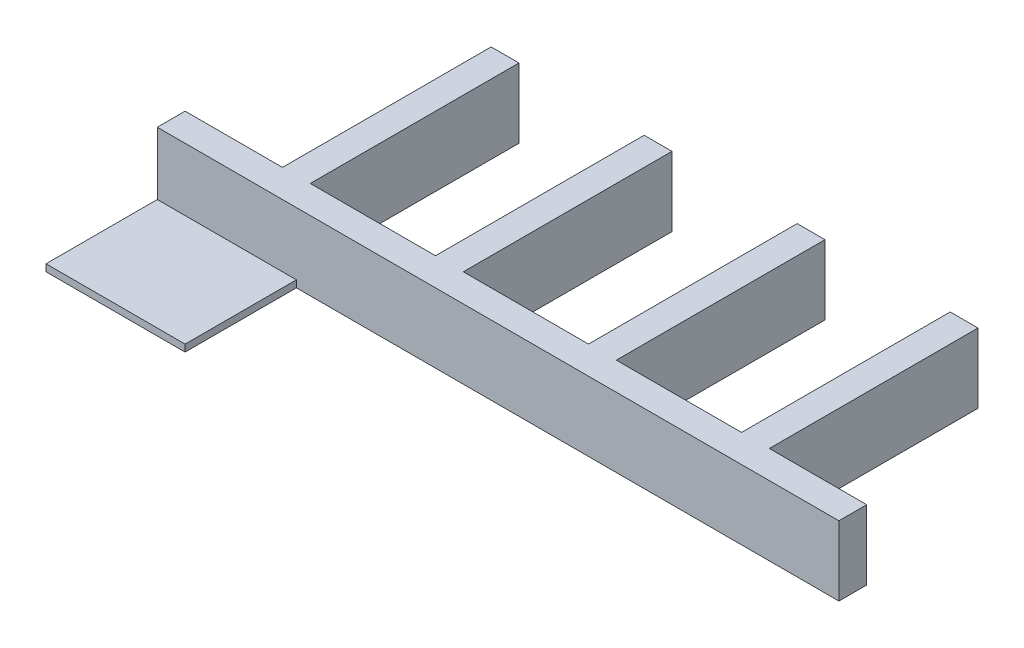
ISO-10303-21;
HEADER;
FILE_DESCRIPTION(('STEP AP214'),'2;1');
FILE_NAME('part.step','',(''),(''),'','','');
FILE_SCHEMA(('AUTOMOTIVE_DESIGN { 1 0 10303 214 1 1 1 1 }'));
ENDSEC;
DATA;
#1=APPLICATION_CONTEXT('core data for automotive mechanical design processes');
#2=APPLICATION_PROTOCOL_DEFINITION('international standard','automotive_design',2000,#1);
#3=PRODUCT_CONTEXT('',#1,'mechanical');
#4=PRODUCT('Part','Part','',(#3));
#5=PRODUCT_RELATED_PRODUCT_CATEGORY('part','',(#4));
#6=PRODUCT_DEFINITION_FORMATION('','',#4);
#7=PRODUCT_DEFINITION_CONTEXT('part definition',#1,'design');
#8=PRODUCT_DEFINITION('design','',#6,#7);
#9=PRODUCT_DEFINITION_SHAPE('','',#8);
#10=(LENGTH_UNIT() NAMED_UNIT(*) SI_UNIT(.MILLI.,.METRE.));
#11=(NAMED_UNIT(*) PLANE_ANGLE_UNIT() SI_UNIT($,.RADIAN.));
#12=(NAMED_UNIT(*) SI_UNIT($,.STERADIAN.) SOLID_ANGLE_UNIT());
#13=UNCERTAINTY_MEASURE_WITH_UNIT(LENGTH_MEASURE(1.E-05),#10,'distance_accuracy_value','');
#14=(GEOMETRIC_REPRESENTATION_CONTEXT(3) GLOBAL_UNCERTAINTY_ASSIGNED_CONTEXT((#13)) GLOBAL_UNIT_ASSIGNED_CONTEXT((#10,
#11,#12)) REPRESENTATION_CONTEXT('',''));
#15=CARTESIAN_POINT('',(0.,0.,0.));
#16=DIRECTION('',(0.,0.,1.));
#17=DIRECTION('',(1.,0.,0.));
#18=AXIS2_PLACEMENT_3D('',#15,#16,#17);
#19=CARTESIAN_POINT('',(0.,50.,0.));
#20=DIRECTION('',(0.,0.,-1.));
#21=DIRECTION('',(-1.,0.,0.));
#22=AXIS2_PLACEMENT_3D('',#19,#20,#21);
#23=PLANE('',#22);
#24=DIRECTION('',(-1.,0.,0.));
#25=VECTOR('',#24,1.);
#26=CARTESIAN_POINT('',(0.,5.,0.));
#27=LINE('',#26,#25);
#28=CARTESIAN_POINT('',(100.,5.,0.));
#29=VERTEX_POINT('',#28);
#30=CARTESIAN_POINT('',(0.,5.,0.));
#31=VERTEX_POINT('',#30);
#32=EDGE_CURVE('E206',#29,#31,#27,.T.);
#33=ORIENTED_EDGE('',*,*,#32,.F.);
#34=DIRECTION('',(0.,1.,0.));
#35=VECTOR('',#34,1.);
#36=CARTESIAN_POINT('',(100.,5.,0.));
#37=LINE('',#36,#35);
#38=CARTESIAN_POINT('',(100.,0.,0.));
#39=VERTEX_POINT('',#38);
#40=EDGE_CURVE('E54',#39,#29,#37,.T.);
#41=ORIENTED_EDGE('',*,*,#40,.F.);
#42=DIRECTION('',(1.,0.,0.));
#43=VECTOR('',#42,1.);
#44=CARTESIAN_POINT('',(0.,0.,0.));
#45=LINE('',#44,#43);
#46=CARTESIAN_POINT('',(490.,0.,0.));
#47=VERTEX_POINT('',#46);
#48=EDGE_CURVE('E210',#39,#47,#45,.T.);
#49=ORIENTED_EDGE('',*,*,#48,.T.);
#50=DIRECTION('',(0.,-1.,0.));
#51=VECTOR('',#50,1.);
#52=CARTESIAN_POINT('',(490.,50.,0.));
#53=LINE('',#52,#51);
#54=CARTESIAN_POINT('',(490.,50.,0.));
#55=VERTEX_POINT('',#54);
#56=EDGE_CURVE('E43',#55,#47,#53,.T.);
#57=ORIENTED_EDGE('',*,*,#56,.F.);
#58=DIRECTION('',(1.,0.,0.));
#59=VECTOR('',#58,1.);
#60=CARTESIAN_POINT('',(0.,50.,0.));
#61=LINE('',#60,#59);
#62=CARTESIAN_POINT('',(0.,50.,0.));
#63=VERTEX_POINT('',#62);
#64=EDGE_CURVE('E221',#63,#55,#61,.T.);
#65=ORIENTED_EDGE('',*,*,#64,.F.);
#66=DIRECTION('',(0.,-1.,0.));
#67=VECTOR('',#66,1.);
#68=CARTESIAN_POINT('',(0.,50.,0.));
#69=LINE('',#68,#67);
#70=EDGE_CURVE('E11',#63,#31,#69,.T.);
#71=ORIENTED_EDGE('',*,*,#70,.T.);
#72=EDGE_LOOP('',(#33,#41,#49,#57,#65,#71));
#73=FACE_BOUND('',#72,.T.);
#74=ADVANCED_FACE('F35',(#73),#23,.F.);
#75=CARTESIAN_POINT('',(0.,50.,-19.9999999999999));
#76=DIRECTION('',(1.,0.,0.));
#77=DIRECTION('',(0.,0.,-1.));
#78=AXIS2_PLACEMENT_3D('',#75,#76,#77);
#79=PLANE('',#78);
#80=DIRECTION('',(0.,0.,1.));
#81=VECTOR('',#80,1.);
#82=CARTESIAN_POINT('',(0.,0.,-19.9999999999999));
#83=LINE('',#82,#81);
#84=CARTESIAN_POINT('',(0.,0.,-19.9999999999999));
#85=VERTEX_POINT('',#84);
#86=CARTESIAN_POINT('',(0.,0.,80.));
#87=VERTEX_POINT('',#86);
#88=EDGE_CURVE('E211',#85,#87,#83,.T.);
#89=ORIENTED_EDGE('',*,*,#88,.T.);
#90=DIRECTION('',(0.,-1.,0.));
#91=VECTOR('',#90,1.);
#92=CARTESIAN_POINT('',(0.,0.,80.));
#93=LINE('',#92,#91);
#94=CARTESIAN_POINT('',(0.,5.,80.));
#95=VERTEX_POINT('',#94);
#96=EDGE_CURVE('E203',#95,#87,#93,.T.);
#97=ORIENTED_EDGE('',*,*,#96,.F.);
#98=DIRECTION('',(0.,0.,-1.));
#99=VECTOR('',#98,1.);
#100=CARTESIAN_POINT('',(0.,5.,80.));
#101=LINE('',#100,#99);
#102=EDGE_CURVE('E214',#95,#31,#101,.T.);
#103=ORIENTED_EDGE('',*,*,#102,.T.);
#104=ORIENTED_EDGE('',*,*,#70,.F.);
#105=DIRECTION('',(0.,0.,1.));
#106=VECTOR('',#105,1.);
#107=CARTESIAN_POINT('',(0.,50.,-19.9999999999999));
#108=LINE('',#107,#106);
#109=CARTESIAN_POINT('',(0.,50.,-19.9999999999999));
#110=VERTEX_POINT('',#109);
#111=EDGE_CURVE('E218',#110,#63,#108,.T.);
#112=ORIENTED_EDGE('',*,*,#111,.F.);
#113=DIRECTION('',(0.,-1.,0.));
#114=VECTOR('',#113,1.);
#115=CARTESIAN_POINT('',(0.,50.,-19.9999999999999));
#116=LINE('',#115,#114);
#117=EDGE_CURVE('E259',#110,#85,#116,.T.);
#118=ORIENTED_EDGE('',*,*,#117,.T.);
#119=EDGE_LOOP('',(#89,#97,#103,#104,#112,#118));
#120=FACE_BOUND('',#119,.T.);
#121=ADVANCED_FACE('F37',(#120),#79,.F.);
#122=CARTESIAN_POINT('',(490.,50.,0.));
#123=DIRECTION('',(-1.,0.,0.));
#124=DIRECTION('',(0.,0.,1.));
#125=AXIS2_PLACEMENT_3D('',#122,#123,#124);
#126=PLANE('',#125);
#127=DIRECTION('',(0.,0.,-1.));
#128=VECTOR('',#127,1.);
#129=CARTESIAN_POINT('',(490.,0.,0.));
#130=LINE('',#129,#128);
#131=CARTESIAN_POINT('',(490.,0.,-20.));
#132=VERTEX_POINT('',#131);
#133=EDGE_CURVE('E262',#47,#132,#130,.T.);
#134=ORIENTED_EDGE('',*,*,#133,.T.);
#135=DIRECTION('',(0.,-1.,0.));
#136=VECTOR('',#135,1.);
#137=CARTESIAN_POINT('',(490.,50.,-20.));
#138=LINE('',#137,#136);
#139=CARTESIAN_POINT('',(490.,50.,-20.));
#140=VERTEX_POINT('',#139);
#141=EDGE_CURVE('E347',#140,#132,#138,.T.);
#142=ORIENTED_EDGE('',*,*,#141,.F.);
#143=DIRECTION('',(0.,0.,-1.));
#144=VECTOR('',#143,1.);
#145=CARTESIAN_POINT('',(490.,50.,0.));
#146=LINE('',#145,#144);
#147=EDGE_CURVE('E224',#55,#140,#146,.T.);
#148=ORIENTED_EDGE('',*,*,#147,.F.);
#149=ORIENTED_EDGE('',*,*,#56,.T.);
#150=EDGE_LOOP('',(#134,#142,#148,#149));
#151=FACE_BOUND('',#150,.T.);
#152=ADVANCED_FACE('F353',(#151),#126,.F.);
#153=CARTESIAN_POINT('',(490.,50.,-20.));
#154=DIRECTION('',(0.,0.,1.));
#155=DIRECTION('',(1.,0.,0.));
#156=AXIS2_PLACEMENT_3D('',#153,#154,#155);
#157=PLANE('',#156);
#158=DIRECTION('',(-1.,0.,0.));
#159=VECTOR('',#158,1.);
#160=CARTESIAN_POINT('',(490.,0.,-20.));
#161=LINE('',#160,#159);
#162=CARTESIAN_POINT('',(420.,0.,-20.));
#163=VERTEX_POINT('',#162);
#164=EDGE_CURVE('E264',#132,#163,#161,.T.);
#165=ORIENTED_EDGE('',*,*,#164,.T.);
#166=DIRECTION('',(0.,-1.,0.));
#167=VECTOR('',#166,1.);
#168=CARTESIAN_POINT('',(420.,50.,-20.));
#169=LINE('',#168,#167);
#170=CARTESIAN_POINT('',(420.,50.,-20.));
#171=VERTEX_POINT('',#170);
#172=EDGE_CURVE('E344',#171,#163,#169,.T.);
#173=ORIENTED_EDGE('',*,*,#172,.F.);
#174=DIRECTION('',(-1.,0.,0.));
#175=VECTOR('',#174,1.);
#176=CARTESIAN_POINT('',(490.,50.,-20.));
#177=LINE('',#176,#175);
#178=EDGE_CURVE('E226',#140,#171,#177,.T.);
#179=ORIENTED_EDGE('',*,*,#178,.F.);
#180=ORIENTED_EDGE('',*,*,#141,.T.);
#181=EDGE_LOOP('',(#165,#173,#179,#180));
#182=FACE_BOUND('',#181,.T.);
#183=ADVANCED_FACE('F360',(#182),#157,.F.);
#184=CARTESIAN_POINT('',(420.,50.,-170.));
#185=DIRECTION('',(-1.,0.,0.));
#186=DIRECTION('',(0.,0.,1.));
#187=AXIS2_PLACEMENT_3D('',#184,#185,#186);
#188=PLANE('',#187);
#189=DIRECTION('',(0.,0.,-1.));
#190=VECTOR('',#189,1.);
#191=CARTESIAN_POINT('',(420.,0.,-170.));
#192=LINE('',#191,#190);
#193=CARTESIAN_POINT('',(420.,0.,-170.));
#194=VERTEX_POINT('',#193);
#195=EDGE_CURVE('E266',#163,#194,#192,.T.);
#196=ORIENTED_EDGE('',*,*,#195,.T.);
#197=DIRECTION('',(0.,-1.,0.));
#198=VECTOR('',#197,1.);
#199=CARTESIAN_POINT('',(420.,50.,-170.));
#200=LINE('',#199,#198);
#201=CARTESIAN_POINT('',(420.,50.,-170.));
#202=VERTEX_POINT('',#201);
#203=EDGE_CURVE('E341',#202,#194,#200,.T.);
#204=ORIENTED_EDGE('',*,*,#203,.F.);
#205=DIRECTION('',(0.,0.,-1.));
#206=VECTOR('',#205,1.);
#207=CARTESIAN_POINT('',(420.,50.,-170.));
#208=LINE('',#207,#206);
#209=EDGE_CURVE('E228',#171,#202,#208,.T.);
#210=ORIENTED_EDGE('',*,*,#209,.F.);
#211=ORIENTED_EDGE('',*,*,#172,.T.);
#212=EDGE_LOOP('',(#196,#204,#210,#211));
#213=FACE_BOUND('',#212,.T.);
#214=ADVANCED_FACE('F364',(#213),#188,.F.);
#215=CARTESIAN_POINT('',(400.,50.,-170.));
#216=DIRECTION('',(0.,0.,1.));
#217=DIRECTION('',(1.,0.,0.));
#218=AXIS2_PLACEMENT_3D('',#215,#216,#217);
#219=PLANE('',#218);
#220=DIRECTION('',(-1.,0.,0.));
#221=VECTOR('',#220,1.);
#222=CARTESIAN_POINT('',(400.,0.,-170.));
#223=LINE('',#222,#221);
#224=CARTESIAN_POINT('',(400.,0.,-170.));
#225=VERTEX_POINT('',#224);
#226=EDGE_CURVE('E268',#194,#225,#223,.T.);
#227=ORIENTED_EDGE('',*,*,#226,.T.);
#228=DIRECTION('',(0.,-1.,0.));
#229=VECTOR('',#228,1.);
#230=CARTESIAN_POINT('',(400.,50.,-170.));
#231=LINE('',#230,#229);
#232=CARTESIAN_POINT('',(400.,50.,-170.));
#233=VERTEX_POINT('',#232);
#234=EDGE_CURVE('E338',#233,#225,#231,.T.);
#235=ORIENTED_EDGE('',*,*,#234,.F.);
#236=DIRECTION('',(-1.,0.,0.));
#237=VECTOR('',#236,1.);
#238=CARTESIAN_POINT('',(400.,50.,-170.));
#239=LINE('',#238,#237);
#240=EDGE_CURVE('E230',#202,#233,#239,.T.);
#241=ORIENTED_EDGE('',*,*,#240,.F.);
#242=ORIENTED_EDGE('',*,*,#203,.T.);
#243=EDGE_LOOP('',(#227,#235,#241,#242));
#244=FACE_BOUND('',#243,.T.);
#245=ADVANCED_FACE('F385',(#244),#219,.F.);
#246=CARTESIAN_POINT('',(400.,50.,-20.));
#247=DIRECTION('',(1.,0.,0.));
#248=DIRECTION('',(0.,0.,-1.));
#249=AXIS2_PLACEMENT_3D('',#246,#247,#248);
#250=PLANE('',#249);
#251=DIRECTION('',(0.,0.,1.));
#252=VECTOR('',#251,1.);
#253=CARTESIAN_POINT('',(400.,0.,-20.));
#254=LINE('',#253,#252);
#255=CARTESIAN_POINT('',(400.,0.,-20.));
#256=VERTEX_POINT('',#255);
#257=EDGE_CURVE('E270',#225,#256,#254,.T.);
#258=ORIENTED_EDGE('',*,*,#257,.T.);
#259=DIRECTION('',(0.,-1.,0.));
#260=VECTOR('',#259,1.);
#261=CARTESIAN_POINT('',(400.,50.,-20.));
#262=LINE('',#261,#260);
#263=CARTESIAN_POINT('',(400.,50.,-20.));
#264=VERTEX_POINT('',#263);
#265=EDGE_CURVE('E335',#264,#256,#262,.T.);
#266=ORIENTED_EDGE('',*,*,#265,.F.);
#267=DIRECTION('',(0.,0.,1.));
#268=VECTOR('',#267,1.);
#269=CARTESIAN_POINT('',(400.,50.,-20.));
#270=LINE('',#269,#268);
#271=EDGE_CURVE('E232',#233,#264,#270,.T.);
#272=ORIENTED_EDGE('',*,*,#271,.F.);
#273=ORIENTED_EDGE('',*,*,#234,.T.);
#274=EDGE_LOOP('',(#258,#266,#272,#273));
#275=FACE_BOUND('',#274,.T.);
#276=ADVANCED_FACE('F388',(#275),#250,.F.);
#277=CARTESIAN_POINT('',(400.,50.,-20.));
#278=DIRECTION('',(0.,0.,1.));
#279=DIRECTION('',(1.,0.,0.));
#280=AXIS2_PLACEMENT_3D('',#277,#278,#279);
#281=PLANE('',#280);
#282=DIRECTION('',(-1.,0.,0.));
#283=VECTOR('',#282,1.);
#284=CARTESIAN_POINT('',(400.,0.,-20.));
#285=LINE('',#284,#283);
#286=CARTESIAN_POINT('',(310.,0.,-20.));
#287=VERTEX_POINT('',#286);
#288=EDGE_CURVE('E272',#256,#287,#285,.T.);
#289=ORIENTED_EDGE('',*,*,#288,.T.);
#290=DIRECTION('',(0.,-1.,0.));
#291=VECTOR('',#290,1.);
#292=CARTESIAN_POINT('',(310.,50.,-20.));
#293=LINE('',#292,#291);
#294=CARTESIAN_POINT('',(310.,50.,-20.));
#295=VERTEX_POINT('',#294);
#296=EDGE_CURVE('E332',#295,#287,#293,.T.);
#297=ORIENTED_EDGE('',*,*,#296,.F.);
#298=DIRECTION('',(-1.,0.,0.));
#299=VECTOR('',#298,1.);
#300=CARTESIAN_POINT('',(400.,50.,-20.));
#301=LINE('',#300,#299);
#302=EDGE_CURVE('E234',#264,#295,#301,.T.);
#303=ORIENTED_EDGE('',*,*,#302,.F.);
#304=ORIENTED_EDGE('',*,*,#265,.T.);
#305=EDGE_LOOP('',(#289,#297,#303,#304));
#306=FACE_BOUND('',#305,.T.);
#307=ADVANCED_FACE('F392',(#306),#281,.F.);
#308=CARTESIAN_POINT('',(310.,50.,-170.));
#309=DIRECTION('',(-1.,0.,0.));
#310=DIRECTION('',(0.,0.,1.));
#311=AXIS2_PLACEMENT_3D('',#308,#309,#310);
#312=PLANE('',#311);
#313=DIRECTION('',(0.,0.,-1.));
#314=VECTOR('',#313,1.);
#315=CARTESIAN_POINT('',(310.,0.,-170.));
#316=LINE('',#315,#314);
#317=CARTESIAN_POINT('',(310.,0.,-170.));
#318=VERTEX_POINT('',#317);
#319=EDGE_CURVE('E274',#287,#318,#316,.T.);
#320=ORIENTED_EDGE('',*,*,#319,.T.);
#321=DIRECTION('',(0.,-1.,0.));
#322=VECTOR('',#321,1.);
#323=CARTESIAN_POINT('',(310.,50.,-170.));
#324=LINE('',#323,#322);
#325=CARTESIAN_POINT('',(310.,50.,-170.));
#326=VERTEX_POINT('',#325);
#327=EDGE_CURVE('E329',#326,#318,#324,.T.);
#328=ORIENTED_EDGE('',*,*,#327,.F.);
#329=DIRECTION('',(0.,0.,-1.));
#330=VECTOR('',#329,1.);
#331=CARTESIAN_POINT('',(310.,50.,-170.));
#332=LINE('',#331,#330);
#333=EDGE_CURVE('E236',#295,#326,#332,.T.);
#334=ORIENTED_EDGE('',*,*,#333,.F.);
#335=ORIENTED_EDGE('',*,*,#296,.T.);
#336=EDGE_LOOP('',(#320,#328,#334,#335));
#337=FACE_BOUND('',#336,.T.);
#338=ADVANCED_FACE('F396',(#337),#312,.F.);
#339=CARTESIAN_POINT('',(290.,50.,-170.));
#340=DIRECTION('',(0.,0.,1.));
#341=DIRECTION('',(1.,0.,0.));
#342=AXIS2_PLACEMENT_3D('',#339,#340,#341);
#343=PLANE('',#342);
#344=DIRECTION('',(-1.,0.,0.));
#345=VECTOR('',#344,1.);
#346=CARTESIAN_POINT('',(290.,0.,-170.));
#347=LINE('',#346,#345);
#348=CARTESIAN_POINT('',(290.,0.,-170.));
#349=VERTEX_POINT('',#348);
#350=EDGE_CURVE('E276',#318,#349,#347,.T.);
#351=ORIENTED_EDGE('',*,*,#350,.T.);
#352=DIRECTION('',(0.,-1.,0.));
#353=VECTOR('',#352,1.);
#354=CARTESIAN_POINT('',(290.,50.,-170.));
#355=LINE('',#354,#353);
#356=CARTESIAN_POINT('',(290.,50.,-170.));
#357=VERTEX_POINT('',#356);
#358=EDGE_CURVE('E326',#357,#349,#355,.T.);
#359=ORIENTED_EDGE('',*,*,#358,.F.);
#360=DIRECTION('',(-1.,0.,0.));
#361=VECTOR('',#360,1.);
#362=CARTESIAN_POINT('',(290.,50.,-170.));
#363=LINE('',#362,#361);
#364=EDGE_CURVE('E238',#326,#357,#363,.T.);
#365=ORIENTED_EDGE('',*,*,#364,.F.);
#366=ORIENTED_EDGE('',*,*,#327,.T.);
#367=EDGE_LOOP('',(#351,#359,#365,#366));
#368=FACE_BOUND('',#367,.T.);
#369=ADVANCED_FACE('F400',(#368),#343,.F.);
#370=CARTESIAN_POINT('',(290.,50.,-20.));
#371=DIRECTION('',(1.,0.,0.));
#372=DIRECTION('',(0.,0.,-1.));
#373=AXIS2_PLACEMENT_3D('',#370,#371,#372);
#374=PLANE('',#373);
#375=DIRECTION('',(0.,0.,1.));
#376=VECTOR('',#375,1.);
#377=CARTESIAN_POINT('',(290.,0.,-20.));
#378=LINE('',#377,#376);
#379=CARTESIAN_POINT('',(290.,0.,-20.));
#380=VERTEX_POINT('',#379);
#381=EDGE_CURVE('E278',#349,#380,#378,.T.);
#382=ORIENTED_EDGE('',*,*,#381,.T.);
#383=DIRECTION('',(0.,-1.,0.));
#384=VECTOR('',#383,1.);
#385=CARTESIAN_POINT('',(290.,50.,-20.));
#386=LINE('',#385,#384);
#387=CARTESIAN_POINT('',(290.,50.,-20.));
#388=VERTEX_POINT('',#387);
#389=EDGE_CURVE('E323',#388,#380,#386,.T.);
#390=ORIENTED_EDGE('',*,*,#389,.F.);
#391=DIRECTION('',(0.,0.,1.));
#392=VECTOR('',#391,1.);
#393=CARTESIAN_POINT('',(290.,50.,-20.));
#394=LINE('',#393,#392);
#395=EDGE_CURVE('E240',#357,#388,#394,.T.);
#396=ORIENTED_EDGE('',*,*,#395,.F.);
#397=ORIENTED_EDGE('',*,*,#358,.T.);
#398=EDGE_LOOP('',(#382,#390,#396,#397));
#399=FACE_BOUND('',#398,.T.);
#400=ADVANCED_FACE('F404',(#399),#374,.F.);
#401=CARTESIAN_POINT('',(290.,50.,-20.));
#402=DIRECTION('',(0.,0.,1.));
#403=DIRECTION('',(1.,0.,0.));
#404=AXIS2_PLACEMENT_3D('',#401,#402,#403);
#405=PLANE('',#404);
#406=DIRECTION('',(-1.,0.,0.));
#407=VECTOR('',#406,1.);
#408=CARTESIAN_POINT('',(290.,0.,-20.));
#409=LINE('',#408,#407);
#410=CARTESIAN_POINT('',(200.,0.,-20.));
#411=VERTEX_POINT('',#410);
#412=EDGE_CURVE('E280',#380,#411,#409,.T.);
#413=ORIENTED_EDGE('',*,*,#412,.T.);
#414=DIRECTION('',(0.,-1.,0.));
#415=VECTOR('',#414,1.);
#416=CARTESIAN_POINT('',(200.,50.,-20.));
#417=LINE('',#416,#415);
#418=CARTESIAN_POINT('',(200.,50.,-20.));
#419=VERTEX_POINT('',#418);
#420=EDGE_CURVE('E320',#419,#411,#417,.T.);
#421=ORIENTED_EDGE('',*,*,#420,.F.);
#422=DIRECTION('',(-1.,0.,0.));
#423=VECTOR('',#422,1.);
#424=CARTESIAN_POINT('',(290.,50.,-20.));
#425=LINE('',#424,#423);
#426=EDGE_CURVE('E242',#388,#419,#425,.T.);
#427=ORIENTED_EDGE('',*,*,#426,.F.);
#428=ORIENTED_EDGE('',*,*,#389,.T.);
#429=EDGE_LOOP('',(#413,#421,#427,#428));
#430=FACE_BOUND('',#429,.T.);
#431=ADVANCED_FACE('F408',(#430),#405,.F.);
#432=CARTESIAN_POINT('',(200.,50.,-170.));
#433=DIRECTION('',(-1.,0.,0.));
#434=DIRECTION('',(0.,0.,1.));
#435=AXIS2_PLACEMENT_3D('',#432,#433,#434);
#436=PLANE('',#435);
#437=DIRECTION('',(0.,0.,-1.));
#438=VECTOR('',#437,1.);
#439=CARTESIAN_POINT('',(200.,0.,-170.));
#440=LINE('',#439,#438);
#441=CARTESIAN_POINT('',(200.,0.,-170.));
#442=VERTEX_POINT('',#441);
#443=EDGE_CURVE('E282',#411,#442,#440,.T.);
#444=ORIENTED_EDGE('',*,*,#443,.T.);
#445=DIRECTION('',(0.,-1.,0.));
#446=VECTOR('',#445,1.);
#447=CARTESIAN_POINT('',(200.,50.,-170.));
#448=LINE('',#447,#446);
#449=CARTESIAN_POINT('',(200.,50.,-170.));
#450=VERTEX_POINT('',#449);
#451=EDGE_CURVE('E317',#450,#442,#448,.T.);
#452=ORIENTED_EDGE('',*,*,#451,.F.);
#453=DIRECTION('',(0.,0.,-1.));
#454=VECTOR('',#453,1.);
#455=CARTESIAN_POINT('',(200.,50.,-170.));
#456=LINE('',#455,#454);
#457=EDGE_CURVE('E244',#419,#450,#456,.T.);
#458=ORIENTED_EDGE('',*,*,#457,.F.);
#459=ORIENTED_EDGE('',*,*,#420,.T.);
#460=EDGE_LOOP('',(#444,#452,#458,#459));
#461=FACE_BOUND('',#460,.T.);
#462=ADVANCED_FACE('F412',(#461),#436,.F.);
#463=CARTESIAN_POINT('',(180.,50.,-170.));
#464=DIRECTION('',(0.,0.,1.));
#465=DIRECTION('',(1.,0.,0.));
#466=AXIS2_PLACEMENT_3D('',#463,#464,#465);
#467=PLANE('',#466);
#468=DIRECTION('',(-1.,0.,0.));
#469=VECTOR('',#468,1.);
#470=CARTESIAN_POINT('',(180.,0.,-170.));
#471=LINE('',#470,#469);
#472=CARTESIAN_POINT('',(180.,0.,-170.));
#473=VERTEX_POINT('',#472);
#474=EDGE_CURVE('E284',#442,#473,#471,.T.);
#475=ORIENTED_EDGE('',*,*,#474,.T.);
#476=DIRECTION('',(0.,-1.,0.));
#477=VECTOR('',#476,1.);
#478=CARTESIAN_POINT('',(180.,50.,-170.));
#479=LINE('',#478,#477);
#480=CARTESIAN_POINT('',(180.,50.,-170.));
#481=VERTEX_POINT('',#480);
#482=EDGE_CURVE('E314',#481,#473,#479,.T.);
#483=ORIENTED_EDGE('',*,*,#482,.F.);
#484=DIRECTION('',(-1.,0.,0.));
#485=VECTOR('',#484,1.);
#486=CARTESIAN_POINT('',(180.,50.,-170.));
#487=LINE('',#486,#485);
#488=EDGE_CURVE('E246',#450,#481,#487,.T.);
#489=ORIENTED_EDGE('',*,*,#488,.F.);
#490=ORIENTED_EDGE('',*,*,#451,.T.);
#491=EDGE_LOOP('',(#475,#483,#489,#490));
#492=FACE_BOUND('',#491,.T.);
#493=ADVANCED_FACE('F416',(#492),#467,.F.);
#494=CARTESIAN_POINT('',(180.,50.,-20.));
#495=DIRECTION('',(1.,0.,0.));
#496=DIRECTION('',(0.,0.,-1.));
#497=AXIS2_PLACEMENT_3D('',#494,#495,#496);
#498=PLANE('',#497);
#499=DIRECTION('',(0.,0.,1.));
#500=VECTOR('',#499,1.);
#501=CARTESIAN_POINT('',(180.,0.,-20.));
#502=LINE('',#501,#500);
#503=CARTESIAN_POINT('',(180.,0.,-20.));
#504=VERTEX_POINT('',#503);
#505=EDGE_CURVE('E286',#473,#504,#502,.T.);
#506=ORIENTED_EDGE('',*,*,#505,.T.);
#507=DIRECTION('',(0.,-1.,0.));
#508=VECTOR('',#507,1.);
#509=CARTESIAN_POINT('',(180.,50.,-20.));
#510=LINE('',#509,#508);
#511=CARTESIAN_POINT('',(180.,50.,-20.));
#512=VERTEX_POINT('',#511);
#513=EDGE_CURVE('E311',#512,#504,#510,.T.);
#514=ORIENTED_EDGE('',*,*,#513,.F.);
#515=DIRECTION('',(0.,0.,1.));
#516=VECTOR('',#515,1.);
#517=CARTESIAN_POINT('',(180.,50.,-20.));
#518=LINE('',#517,#516);
#519=EDGE_CURVE('E248',#481,#512,#518,.T.);
#520=ORIENTED_EDGE('',*,*,#519,.F.);
#521=ORIENTED_EDGE('',*,*,#482,.T.);
#522=EDGE_LOOP('',(#506,#514,#520,#521));
#523=FACE_BOUND('',#522,.T.);
#524=ADVANCED_FACE('F420',(#523),#498,.F.);
#525=CARTESIAN_POINT('',(180.,50.,-20.));
#526=DIRECTION('',(0.,0.,1.));
#527=DIRECTION('',(1.,0.,0.));
#528=AXIS2_PLACEMENT_3D('',#525,#526,#527);
#529=PLANE('',#528);
#530=DIRECTION('',(-1.,0.,0.));
#531=VECTOR('',#530,1.);
#532=CARTESIAN_POINT('',(180.,0.,-20.));
#533=LINE('',#532,#531);
#534=CARTESIAN_POINT('',(90.,0.,-19.9999999999999));
#535=VERTEX_POINT('',#534);
#536=EDGE_CURVE('E288',#504,#535,#533,.T.);
#537=ORIENTED_EDGE('',*,*,#536,.T.);
#538=DIRECTION('',(0.,-1.,0.));
#539=VECTOR('',#538,1.);
#540=CARTESIAN_POINT('',(90.,50.,-19.9999999999999));
#541=LINE('',#540,#539);
#542=CARTESIAN_POINT('',(90.,50.,-19.9999999999999));
#543=VERTEX_POINT('',#542);
#544=EDGE_CURVE('E308',#543,#535,#541,.T.);
#545=ORIENTED_EDGE('',*,*,#544,.F.);
#546=DIRECTION('',(-1.,0.,0.));
#547=VECTOR('',#546,1.);
#548=CARTESIAN_POINT('',(180.,50.,-20.));
#549=LINE('',#548,#547);
#550=EDGE_CURVE('E250',#512,#543,#549,.T.);
#551=ORIENTED_EDGE('',*,*,#550,.F.);
#552=ORIENTED_EDGE('',*,*,#513,.T.);
#553=EDGE_LOOP('',(#537,#545,#551,#552));
#554=FACE_BOUND('',#553,.T.);
#555=ADVANCED_FACE('F424',(#554),#529,.F.);
#556=CARTESIAN_POINT('',(90.,50.,-170.));
#557=DIRECTION('',(-1.,0.,0.));
#558=DIRECTION('',(0.,0.,1.));
#559=AXIS2_PLACEMENT_3D('',#556,#557,#558);
#560=PLANE('',#559);
#561=DIRECTION('',(0.,0.,-1.));
#562=VECTOR('',#561,1.);
#563=CARTESIAN_POINT('',(90.,0.,-170.));
#564=LINE('',#563,#562);
#565=CARTESIAN_POINT('',(90.,0.,-170.));
#566=VERTEX_POINT('',#565);
#567=EDGE_CURVE('E290',#535,#566,#564,.T.);
#568=ORIENTED_EDGE('',*,*,#567,.T.);
#569=DIRECTION('',(0.,-1.,0.));
#570=VECTOR('',#569,1.);
#571=CARTESIAN_POINT('',(90.,50.,-170.));
#572=LINE('',#571,#570);
#573=CARTESIAN_POINT('',(90.,50.,-170.));
#574=VERTEX_POINT('',#573);
#575=EDGE_CURVE('E305',#574,#566,#572,.T.);
#576=ORIENTED_EDGE('',*,*,#575,.F.);
#577=DIRECTION('',(0.,0.,-1.));
#578=VECTOR('',#577,1.);
#579=CARTESIAN_POINT('',(90.,50.,-170.));
#580=LINE('',#579,#578);
#581=EDGE_CURVE('E252',#543,#574,#580,.T.);
#582=ORIENTED_EDGE('',*,*,#581,.F.);
#583=ORIENTED_EDGE('',*,*,#544,.T.);
#584=EDGE_LOOP('',(#568,#576,#582,#583));
#585=FACE_BOUND('',#584,.T.);
#586=ADVANCED_FACE('F428',(#585),#560,.F.);
#587=CARTESIAN_POINT('',(70.,50.,-170.));
#588=DIRECTION('',(0.,0.,1.));
#589=DIRECTION('',(1.,0.,0.));
#590=AXIS2_PLACEMENT_3D('',#587,#588,#589);
#591=PLANE('',#590);
#592=DIRECTION('',(-1.,0.,0.));
#593=VECTOR('',#592,1.);
#594=CARTESIAN_POINT('',(70.,0.,-170.));
#595=LINE('',#594,#593);
#596=CARTESIAN_POINT('',(70.,0.,-170.));
#597=VERTEX_POINT('',#596);
#598=EDGE_CURVE('E292',#566,#597,#595,.T.);
#599=ORIENTED_EDGE('',*,*,#598,.T.);
#600=DIRECTION('',(0.,-1.,0.));
#601=VECTOR('',#600,1.);
#602=CARTESIAN_POINT('',(70.,50.,-170.));
#603=LINE('',#602,#601);
#604=CARTESIAN_POINT('',(70.,50.,-170.));
#605=VERTEX_POINT('',#604);
#606=EDGE_CURVE('E302',#605,#597,#603,.T.);
#607=ORIENTED_EDGE('',*,*,#606,.F.);
#608=DIRECTION('',(-1.,0.,0.));
#609=VECTOR('',#608,1.);
#610=CARTESIAN_POINT('',(70.,50.,-170.));
#611=LINE('',#610,#609);
#612=EDGE_CURVE('E254',#574,#605,#611,.T.);
#613=ORIENTED_EDGE('',*,*,#612,.F.);
#614=ORIENTED_EDGE('',*,*,#575,.T.);
#615=EDGE_LOOP('',(#599,#607,#613,#614));
#616=FACE_BOUND('',#615,.T.);
#617=ADVANCED_FACE('F432',(#616),#591,.F.);
#618=CARTESIAN_POINT('',(70.,50.,-170.));
#619=DIRECTION('',(1.,0.,0.));
#620=DIRECTION('',(0.,0.,-1.));
#621=AXIS2_PLACEMENT_3D('',#618,#619,#620);
#622=PLANE('',#621);
#623=DIRECTION('',(0.,0.,1.));
#624=VECTOR('',#623,1.);
#625=CARTESIAN_POINT('',(70.,0.,-170.));
#626=LINE('',#625,#624);
#627=CARTESIAN_POINT('',(70.,0.,-19.9999999999999));
#628=VERTEX_POINT('',#627);
#629=EDGE_CURVE('E294',#597,#628,#626,.T.);
#630=ORIENTED_EDGE('',*,*,#629,.T.);
#631=DIRECTION('',(0.,-1.,0.));
#632=VECTOR('',#631,1.);
#633=CARTESIAN_POINT('',(70.,50.,-19.9999999999999));
#634=LINE('',#633,#632);
#635=CARTESIAN_POINT('',(70.,50.,-19.9999999999999));
#636=VERTEX_POINT('',#635);
#637=EDGE_CURVE('E299',#636,#628,#634,.T.);
#638=ORIENTED_EDGE('',*,*,#637,.F.);
#639=DIRECTION('',(0.,0.,1.));
#640=VECTOR('',#639,1.);
#641=CARTESIAN_POINT('',(70.,50.,-170.));
#642=LINE('',#641,#640);
#643=EDGE_CURVE('E256',#605,#636,#642,.T.);
#644=ORIENTED_EDGE('',*,*,#643,.F.);
#645=ORIENTED_EDGE('',*,*,#606,.T.);
#646=EDGE_LOOP('',(#630,#638,#644,#645));
#647=FACE_BOUND('',#646,.T.);
#648=ADVANCED_FACE('F436',(#647),#622,.F.);
#649=CARTESIAN_POINT('',(70.,50.,-19.9999999999999));
#650=DIRECTION('',(0.,0.,1.));
#651=DIRECTION('',(1.,0.,0.));
#652=AXIS2_PLACEMENT_3D('',#649,#650,#651);
#653=PLANE('',#652);
#654=DIRECTION('',(-1.,0.,0.));
#655=VECTOR('',#654,1.);
#656=CARTESIAN_POINT('',(70.,0.,-19.9999999999999));
#657=LINE('',#656,#655);
#658=EDGE_CURVE('E222',#628,#85,#657,.T.);
#659=ORIENTED_EDGE('',*,*,#658,.T.);
#660=ORIENTED_EDGE('',*,*,#117,.F.);
#661=DIRECTION('',(-1.,0.,0.));
#662=VECTOR('',#661,1.);
#663=CARTESIAN_POINT('',(70.,50.,-19.9999999999999));
#664=LINE('',#663,#662);
#665=EDGE_CURVE('E258',#636,#110,#664,.T.);
#666=ORIENTED_EDGE('',*,*,#665,.F.);
#667=ORIENTED_EDGE('',*,*,#637,.T.);
#668=EDGE_LOOP('',(#659,#660,#666,#667));
#669=FACE_BOUND('',#668,.T.);
#670=ADVANCED_FACE('F440',(#669),#653,.F.);
#671=CARTESIAN_POINT('',(0.,50.,0.));
#672=DIRECTION('',(0.,1.,0.));
#673=DIRECTION('',(0.,0.,1.));
#674=AXIS2_PLACEMENT_3D('',#671,#672,#673);
#675=PLANE('',#674);
#676=ORIENTED_EDGE('',*,*,#111,.T.);
#677=ORIENTED_EDGE('',*,*,#64,.T.);
#678=ORIENTED_EDGE('',*,*,#147,.T.);
#679=ORIENTED_EDGE('',*,*,#178,.T.);
#680=ORIENTED_EDGE('',*,*,#209,.T.);
#681=ORIENTED_EDGE('',*,*,#240,.T.);
#682=ORIENTED_EDGE('',*,*,#271,.T.);
#683=ORIENTED_EDGE('',*,*,#302,.T.);
#684=ORIENTED_EDGE('',*,*,#333,.T.);
#685=ORIENTED_EDGE('',*,*,#364,.T.);
#686=ORIENTED_EDGE('',*,*,#395,.T.);
#687=ORIENTED_EDGE('',*,*,#426,.T.);
#688=ORIENTED_EDGE('',*,*,#457,.T.);
#689=ORIENTED_EDGE('',*,*,#488,.T.);
#690=ORIENTED_EDGE('',*,*,#519,.T.);
#691=ORIENTED_EDGE('',*,*,#550,.T.);
#692=ORIENTED_EDGE('',*,*,#581,.T.);
#693=ORIENTED_EDGE('',*,*,#612,.T.);
#694=ORIENTED_EDGE('',*,*,#643,.T.);
#695=ORIENTED_EDGE('',*,*,#665,.T.);
#696=EDGE_LOOP('',(#676,#677,#678,#679,#680,#681,#682,#683,#684,#685,#686,#687,#688,#689,#690,
#691,#692,#693,#694,#695));
#697=FACE_BOUND('',#696,.T.);
#698=ADVANCED_FACE('F368',(#697),#675,.T.);
#699=CARTESIAN_POINT('',(0.,0.,0.));
#700=DIRECTION('',(0.,1.,0.));
#701=DIRECTION('',(0.,0.,1.));
#702=AXIS2_PLACEMENT_3D('',#699,#700,#701);
#703=PLANE('',#702);
#704=ORIENTED_EDGE('',*,*,#88,.F.);
#705=ORIENTED_EDGE('',*,*,#658,.F.);
#706=ORIENTED_EDGE('',*,*,#629,.F.);
#707=ORIENTED_EDGE('',*,*,#598,.F.);
#708=ORIENTED_EDGE('',*,*,#567,.F.);
#709=ORIENTED_EDGE('',*,*,#536,.F.);
#710=ORIENTED_EDGE('',*,*,#505,.F.);
#711=ORIENTED_EDGE('',*,*,#474,.F.);
#712=ORIENTED_EDGE('',*,*,#443,.F.);
#713=ORIENTED_EDGE('',*,*,#412,.F.);
#714=ORIENTED_EDGE('',*,*,#381,.F.);
#715=ORIENTED_EDGE('',*,*,#350,.F.);
#716=ORIENTED_EDGE('',*,*,#319,.F.);
#717=ORIENTED_EDGE('',*,*,#288,.F.);
#718=ORIENTED_EDGE('',*,*,#257,.F.);
#719=ORIENTED_EDGE('',*,*,#226,.F.);
#720=ORIENTED_EDGE('',*,*,#195,.F.);
#721=ORIENTED_EDGE('',*,*,#164,.F.);
#722=ORIENTED_EDGE('',*,*,#133,.F.);
#723=ORIENTED_EDGE('',*,*,#48,.F.);
#724=DIRECTION('',(0.,0.,-1.));
#725=VECTOR('',#724,1.);
#726=CARTESIAN_POINT('',(100.,0.,80.));
#727=LINE('',#726,#725);
#728=CARTESIAN_POINT('',(100.,0.,80.));
#729=VERTEX_POINT('',#728);
#730=EDGE_CURVE('E191',#729,#39,#727,.T.);
#731=ORIENTED_EDGE('',*,*,#730,.F.);
#732=DIRECTION('',(1.,0.,0.));
#733=VECTOR('',#732,1.);
#734=CARTESIAN_POINT('',(100.,0.,80.));
#735=LINE('',#734,#733);
#736=EDGE_CURVE('E197',#87,#729,#735,.T.);
#737=ORIENTED_EDGE('',*,*,#736,.F.);
#738=EDGE_LOOP('',(#704,#705,#706,#707,#708,#709,#710,#711,#712,#713,#714,#715,#716,#717,#718,
#719,#720,#721,#722,#723,#731,#737));
#739=FACE_BOUND('',#738,.T.);
#740=ADVANCED_FACE('F208',(#739),#703,.F.);
#741=CARTESIAN_POINT('',(100.,5.,80.));
#742=DIRECTION('',(-1.,0.,0.));
#743=DIRECTION('',(0.,0.,1.));
#744=AXIS2_PLACEMENT_3D('',#741,#742,#743);
#745=PLANE('',#744);
#746=ORIENTED_EDGE('',*,*,#40,.T.);
#747=DIRECTION('',(0.,0.,-1.));
#748=VECTOR('',#747,1.);
#749=CARTESIAN_POINT('',(100.,5.,80.));
#750=LINE('',#749,#748);
#751=CARTESIAN_POINT('',(100.,5.,80.));
#752=VERTEX_POINT('',#751);
#753=EDGE_CURVE('E193',#752,#29,#750,.T.);
#754=ORIENTED_EDGE('',*,*,#753,.F.);
#755=DIRECTION('',(0.,1.,0.));
#756=VECTOR('',#755,1.);
#757=CARTESIAN_POINT('',(100.,5.,80.));
#758=LINE('',#757,#756);
#759=EDGE_CURVE('E187',#729,#752,#758,.T.);
#760=ORIENTED_EDGE('',*,*,#759,.F.);
#761=ORIENTED_EDGE('',*,*,#730,.T.);
#762=EDGE_LOOP('',(#746,#754,#760,#761));
#763=FACE_BOUND('',#762,.T.);
#764=ADVANCED_FACE('F189',(#763),#745,.F.);
#765=CARTESIAN_POINT('',(0.,5.,80.));
#766=DIRECTION('',(0.,-1.,0.));
#767=DIRECTION('',(0.,0.,-1.));
#768=AXIS2_PLACEMENT_3D('',#765,#766,#767);
#769=PLANE('',#768);
#770=ORIENTED_EDGE('',*,*,#32,.T.);
#771=ORIENTED_EDGE('',*,*,#102,.F.);
#772=DIRECTION('',(-1.,0.,0.));
#773=VECTOR('',#772,1.);
#774=CARTESIAN_POINT('',(0.,5.,80.));
#775=LINE('',#774,#773);
#776=EDGE_CURVE('E196',#752,#95,#775,.T.);
#777=ORIENTED_EDGE('',*,*,#776,.F.);
#778=ORIENTED_EDGE('',*,*,#753,.T.);
#779=EDGE_LOOP('',(#770,#771,#777,#778));
#780=FACE_BOUND('',#779,.T.);
#781=ADVANCED_FACE('F451',(#780),#769,.F.);
#782=CARTESIAN_POINT('',(0.,0.,80.));
#783=DIRECTION('',(0.,0.,-1.));
#784=DIRECTION('',(-1.,0.,0.));
#785=AXIS2_PLACEMENT_3D('',#782,#783,#784);
#786=PLANE('',#785);
#787=ORIENTED_EDGE('',*,*,#736,.T.);
#788=ORIENTED_EDGE('',*,*,#759,.T.);
#789=ORIENTED_EDGE('',*,*,#776,.T.);
#790=ORIENTED_EDGE('',*,*,#96,.T.);
#791=EDGE_LOOP('',(#787,#788,#789,#790));
#792=FACE_BOUND('',#791,.T.);
#793=ADVANCED_FACE('F201',(#792),#786,.F.);
#794=CLOSED_SHELL('',(#74,#121,#152,#183,#214,#245,#276,#307,#338,#369,#400,#431,#462,#493,#524,
#555,#586,#617,#648,#670,#698,#740,#764,#781,#793));
#795=MANIFOLD_SOLID_BREP('B2',#794);
#796=ADVANCED_BREP_SHAPE_REPRESENTATION('',(#18,#795),#14);
#797=SHAPE_DEFINITION_REPRESENTATION(#9,#796);
ENDSEC;
END-ISO-10303-21;
